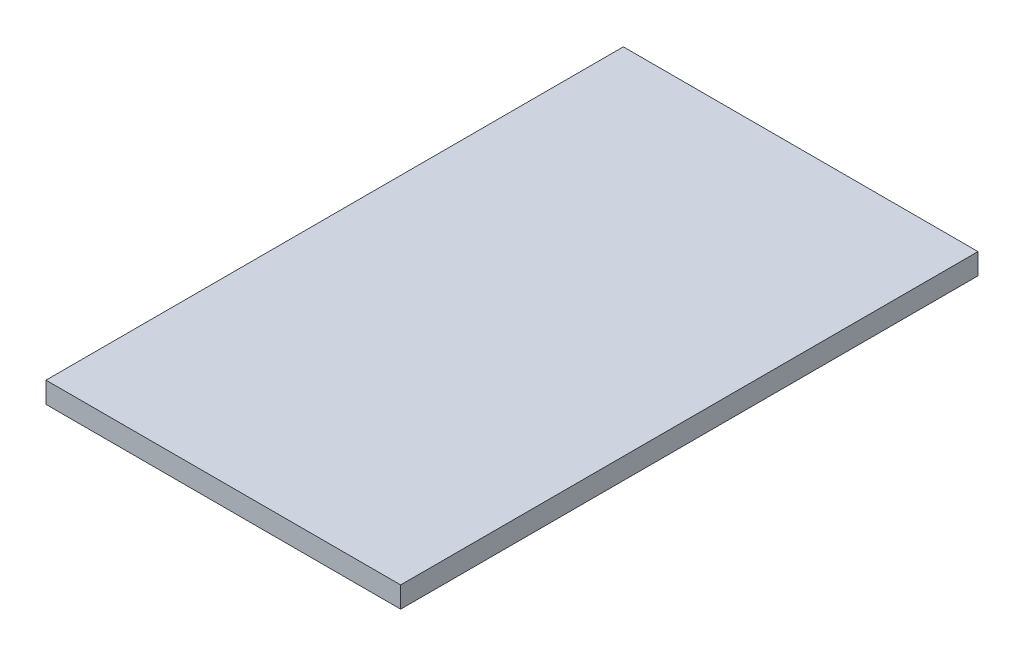
ISO-10303-21;
HEADER;
FILE_DESCRIPTION(('STEP AP214'),'2;1');
FILE_NAME('part.step','',(''),(''),'','','');
FILE_SCHEMA(('AUTOMOTIVE_DESIGN { 1 0 10303 214 1 1 1 1 }'));
ENDSEC;
DATA;
#1=APPLICATION_CONTEXT('core data for automotive mechanical design processes');
#2=APPLICATION_PROTOCOL_DEFINITION('international standard','automotive_design',2000,#1);
#3=PRODUCT_CONTEXT('',#1,'mechanical');
#4=PRODUCT('Part','Part','',(#3));
#5=PRODUCT_RELATED_PRODUCT_CATEGORY('part','',(#4));
#6=PRODUCT_DEFINITION_FORMATION('','',#4);
#7=PRODUCT_DEFINITION_CONTEXT('part definition',#1,'design');
#8=PRODUCT_DEFINITION('design','',#6,#7);
#9=PRODUCT_DEFINITION_SHAPE('','',#8);
#10=(LENGTH_UNIT() NAMED_UNIT(*) SI_UNIT(.MILLI.,.METRE.));
#11=(NAMED_UNIT(*) PLANE_ANGLE_UNIT() SI_UNIT($,.RADIAN.));
#12=(NAMED_UNIT(*) SI_UNIT($,.STERADIAN.) SOLID_ANGLE_UNIT());
#13=UNCERTAINTY_MEASURE_WITH_UNIT(LENGTH_MEASURE(1.E-05),#10,'distance_accuracy_value','');
#14=(GEOMETRIC_REPRESENTATION_CONTEXT(3) GLOBAL_UNCERTAINTY_ASSIGNED_CONTEXT((#13)) GLOBAL_UNIT_ASSIGNED_CONTEXT((#10,
#11,#12)) REPRESENTATION_CONTEXT('',''));
#15=CARTESIAN_POINT('',(0.,0.,0.));
#16=DIRECTION('',(0.,0.,1.));
#17=DIRECTION('',(1.,0.,0.));
#18=AXIS2_PLACEMENT_3D('',#15,#16,#17);
#19=CARTESIAN_POINT('',(21.5,2.55,35.));
#20=DIRECTION('',(-1.,0.,0.));
#21=DIRECTION('',(0.,0.,1.));
#22=AXIS2_PLACEMENT_3D('',#19,#20,#21);
#23=PLANE('',#22);
#24=DIRECTION('',(0.,0.,-1.));
#25=VECTOR('',#24,1.);
#26=CARTESIAN_POINT('',(21.5,0.,35.));
#27=LINE('',#26,#25);
#28=CARTESIAN_POINT('',(21.5,0.,35.));
#29=VERTEX_POINT('',#28);
#30=CARTESIAN_POINT('',(21.5,0.,-35.));
#31=VERTEX_POINT('',#30);
#32=EDGE_CURVE('E124',#29,#31,#27,.T.);
#33=ORIENTED_EDGE('',*,*,#32,.T.);
#34=DIRECTION('',(0.,-1.,0.));
#35=VECTOR('',#34,1.);
#36=CARTESIAN_POINT('',(21.5,2.55,-35.));
#37=LINE('',#36,#35);
#38=CARTESIAN_POINT('',(21.5,2.55,-35.));
#39=VERTEX_POINT('',#38);
#40=EDGE_CURVE('E11',#39,#31,#37,.T.);
#41=ORIENTED_EDGE('',*,*,#40,.F.);
#42=DIRECTION('',(0.,0.,-1.));
#43=VECTOR('',#42,1.);
#44=CARTESIAN_POINT('',(21.5,2.55,35.));
#45=LINE('',#44,#43);
#46=CARTESIAN_POINT('',(21.5,2.55,35.));
#47=VERTEX_POINT('',#46);
#48=EDGE_CURVE('E132',#47,#39,#45,.T.);
#49=ORIENTED_EDGE('',*,*,#48,.F.);
#50=DIRECTION('',(0.,-1.,0.));
#51=VECTOR('',#50,1.);
#52=CARTESIAN_POINT('',(21.5,2.55,35.));
#53=LINE('',#52,#51);
#54=EDGE_CURVE('E141',#47,#29,#53,.T.);
#55=ORIENTED_EDGE('',*,*,#54,.T.);
#56=EDGE_LOOP('',(#33,#41,#49,#55));
#57=FACE_BOUND('',#56,.T.);
#58=ADVANCED_FACE('F39',(#57),#23,.F.);
#59=CARTESIAN_POINT('',(-21.5,2.55,-35.));
#60=DIRECTION('',(0.,0.,1.));
#61=DIRECTION('',(1.,0.,0.));
#62=AXIS2_PLACEMENT_3D('',#59,#60,#61);
#63=PLANE('',#62);
#64=DIRECTION('',(-1.,0.,0.));
#65=VECTOR('',#64,1.);
#66=CARTESIAN_POINT('',(-21.5,0.,-35.));
#67=LINE('',#66,#65);
#68=CARTESIAN_POINT('',(10.16,0.,-35.));
#69=VERTEX_POINT('',#68);
#70=EDGE_CURVE('E143',#31,#69,#67,.T.);
#71=ORIENTED_EDGE('',*,*,#70,.T.);
#72=DIRECTION('',(0.,1.,0.));
#73=VECTOR('',#72,1.);
#74=CARTESIAN_POINT('',(10.16,-2.5,-35.));
#75=LINE('',#74,#73);
#76=CARTESIAN_POINT('',(10.16,-2.5,-35.));
#77=VERTEX_POINT('',#76);
#78=EDGE_CURVE('E108',#77,#69,#75,.T.);
#79=ORIENTED_EDGE('',*,*,#78,.F.);
#80=DIRECTION('',(1.,0.,0.));
#81=VECTOR('',#80,1.);
#82=CARTESIAN_POINT('',(-10.16,-2.5,-35.));
#83=LINE('',#82,#81);
#84=CARTESIAN_POINT('',(-10.16,-2.5,-35.));
#85=VERTEX_POINT('',#84);
#86=EDGE_CURVE('E101',#85,#77,#83,.T.);
#87=ORIENTED_EDGE('',*,*,#86,.F.);
#88=DIRECTION('',(0.,1.,0.));
#89=VECTOR('',#88,1.);
#90=CARTESIAN_POINT('',(-10.16,-2.5,-35.));
#91=LINE('',#90,#89);
#92=CARTESIAN_POINT('',(-10.16,0.,-35.));
#93=VERTEX_POINT('',#92);
#94=EDGE_CURVE('E106',#85,#93,#91,.T.);
#95=ORIENTED_EDGE('',*,*,#94,.T.);
#96=CARTESIAN_POINT('',(-21.5,0.,-35.));
#97=VERTEX_POINT('',#96);
#98=EDGE_CURVE('E58',#93,#97,#67,.T.);
#99=ORIENTED_EDGE('',*,*,#98,.T.);
#100=DIRECTION('',(0.,-1.,0.));
#101=VECTOR('',#100,1.);
#102=CARTESIAN_POINT('',(-21.5,2.55,-35.));
#103=LINE('',#102,#101);
#104=CARTESIAN_POINT('',(-21.5,2.55,-35.));
#105=VERTEX_POINT('',#104);
#106=EDGE_CURVE('E46',#105,#97,#103,.T.);
#107=ORIENTED_EDGE('',*,*,#106,.F.);
#108=DIRECTION('',(-1.,0.,0.));
#109=VECTOR('',#108,1.);
#110=CARTESIAN_POINT('',(-21.5,2.55,-35.));
#111=LINE('',#110,#109);
#112=EDGE_CURVE('E135',#39,#105,#111,.T.);
#113=ORIENTED_EDGE('',*,*,#112,.F.);
#114=ORIENTED_EDGE('',*,*,#40,.T.);
#115=EDGE_LOOP('',(#71,#79,#87,#95,#99,#107,#113,#114));
#116=FACE_BOUND('',#115,.T.);
#117=ADVANCED_FACE('F104',(#116),#63,.F.);
#118=CARTESIAN_POINT('',(-21.5,2.55,35.));
#119=DIRECTION('',(1.,0.,0.));
#120=DIRECTION('',(0.,0.,-1.));
#121=AXIS2_PLACEMENT_3D('',#118,#119,#120);
#122=PLANE('',#121);
#123=DIRECTION('',(0.,0.,1.));
#124=VECTOR('',#123,1.);
#125=CARTESIAN_POINT('',(-21.5,0.,35.));
#126=LINE('',#125,#124);
#127=CARTESIAN_POINT('',(-21.5,0.,35.));
#128=VERTEX_POINT('',#127);
#129=EDGE_CURVE('E145',#97,#128,#126,.T.);
#130=ORIENTED_EDGE('',*,*,#129,.T.);
#131=DIRECTION('',(0.,-1.,0.));
#132=VECTOR('',#131,1.);
#133=CARTESIAN_POINT('',(-21.5,2.55,35.));
#134=LINE('',#133,#132);
#135=CARTESIAN_POINT('',(-21.5,2.55,35.));
#136=VERTEX_POINT('',#135);
#137=EDGE_CURVE('E150',#136,#128,#134,.T.);
#138=ORIENTED_EDGE('',*,*,#137,.F.);
#139=DIRECTION('',(0.,0.,1.));
#140=VECTOR('',#139,1.);
#141=CARTESIAN_POINT('',(-21.5,2.55,35.));
#142=LINE('',#141,#140);
#143=EDGE_CURVE('E138',#105,#136,#142,.T.);
#144=ORIENTED_EDGE('',*,*,#143,.F.);
#145=ORIENTED_EDGE('',*,*,#106,.T.);
#146=EDGE_LOOP('',(#130,#138,#144,#145));
#147=FACE_BOUND('',#146,.T.);
#148=ADVANCED_FACE('F156',(#147),#122,.F.);
#149=CARTESIAN_POINT('',(-21.5,2.55,35.));
#150=DIRECTION('',(0.,0.,-1.));
#151=DIRECTION('',(-1.,0.,0.));
#152=AXIS2_PLACEMENT_3D('',#149,#150,#151);
#153=PLANE('',#152);
#154=DIRECTION('',(1.,0.,0.));
#155=VECTOR('',#154,1.);
#156=CARTESIAN_POINT('',(-21.5,0.,35.));
#157=LINE('',#156,#155);
#158=EDGE_CURVE('E136',#128,#29,#157,.T.);
#159=ORIENTED_EDGE('',*,*,#158,.T.);
#160=ORIENTED_EDGE('',*,*,#54,.F.);
#161=DIRECTION('',(1.,0.,0.));
#162=VECTOR('',#161,1.);
#163=CARTESIAN_POINT('',(-21.5,2.55,35.));
#164=LINE('',#163,#162);
#165=EDGE_CURVE('E140',#136,#47,#164,.T.);
#166=ORIENTED_EDGE('',*,*,#165,.F.);
#167=ORIENTED_EDGE('',*,*,#137,.T.);
#168=EDGE_LOOP('',(#159,#160,#166,#167));
#169=FACE_BOUND('',#168,.T.);
#170=ADVANCED_FACE('F163',(#169),#153,.F.);
#171=CARTESIAN_POINT('',(0.,2.55,0.));
#172=DIRECTION('',(0.,-1.,0.));
#173=DIRECTION('',(0.,0.,-1.));
#174=AXIS2_PLACEMENT_3D('',#171,#172,#173);
#175=PLANE('',#174);
#176=ORIENTED_EDGE('',*,*,#48,.T.);
#177=ORIENTED_EDGE('',*,*,#112,.T.);
#178=ORIENTED_EDGE('',*,*,#143,.T.);
#179=ORIENTED_EDGE('',*,*,#165,.T.);
#180=EDGE_LOOP('',(#176,#177,#178,#179));
#181=FACE_BOUND('',#180,.T.);
#182=ADVANCED_FACE('F169',(#181),#175,.F.);
#183=CARTESIAN_POINT('',(0.,0.,0.));
#184=DIRECTION('',(0.,-1.,0.));
#185=DIRECTION('',(0.,0.,-1.));
#186=AXIS2_PLACEMENT_3D('',#183,#184,#185);
#187=PLANE('',#186);
#188=DIRECTION('',(0.,0.,-1.));
#189=VECTOR('',#188,1.);
#190=CARTESIAN_POINT('',(-10.16,0.,-32.46));
#191=LINE('',#190,#189);
#192=CARTESIAN_POINT('',(-10.16,0.,-32.46));
#193=VERTEX_POINT('',#192);
#194=EDGE_CURVE('E53',#193,#93,#191,.T.);
#195=ORIENTED_EDGE('',*,*,#194,.F.);
#196=DIRECTION('',(-1.,0.,0.));
#197=VECTOR('',#196,1.);
#198=CARTESIAN_POINT('',(-10.16,0.,-32.46));
#199=LINE('',#198,#197);
#200=CARTESIAN_POINT('',(10.16,0.,-32.46));
#201=VERTEX_POINT('',#200);
#202=EDGE_CURVE('E121',#201,#193,#199,.T.);
#203=ORIENTED_EDGE('',*,*,#202,.F.);
#204=DIRECTION('',(0.,0.,1.));
#205=VECTOR('',#204,1.);
#206=CARTESIAN_POINT('',(10.16,0.,-32.46));
#207=LINE('',#206,#205);
#208=EDGE_CURVE('E174',#69,#201,#207,.T.);
#209=ORIENTED_EDGE('',*,*,#208,.F.);
#210=ORIENTED_EDGE('',*,*,#70,.F.);
#211=ORIENTED_EDGE('',*,*,#32,.F.);
#212=ORIENTED_EDGE('',*,*,#158,.F.);
#213=ORIENTED_EDGE('',*,*,#129,.F.);
#214=ORIENTED_EDGE('',*,*,#98,.F.);
#215=EDGE_LOOP('',(#195,#203,#209,#210,#211,#212,#213,#214));
#216=FACE_BOUND('',#215,.T.);
#217=ADVANCED_FACE('F159',(#216),#187,.T.);
#218=CARTESIAN_POINT('',(-10.16,-2.5,-32.46));
#219=DIRECTION('',(1.,0.,0.));
#220=DIRECTION('',(0.,0.,-1.));
#221=AXIS2_PLACEMENT_3D('',#218,#219,#220);
#222=PLANE('',#221);
#223=ORIENTED_EDGE('',*,*,#194,.T.);
#224=ORIENTED_EDGE('',*,*,#94,.F.);
#225=DIRECTION('',(0.,0.,-1.));
#226=VECTOR('',#225,1.);
#227=CARTESIAN_POINT('',(-10.16,-2.5,-32.46));
#228=LINE('',#227,#226);
#229=CARTESIAN_POINT('',(-10.16,-2.5,-32.46));
#230=VERTEX_POINT('',#229);
#231=EDGE_CURVE('E112',#230,#85,#228,.T.);
#232=ORIENTED_EDGE('',*,*,#231,.F.);
#233=DIRECTION('',(0.,1.,0.));
#234=VECTOR('',#233,1.);
#235=CARTESIAN_POINT('',(-10.16,-2.5,-32.46));
#236=LINE('',#235,#234);
#237=EDGE_CURVE('E177',#230,#193,#236,.T.);
#238=ORIENTED_EDGE('',*,*,#237,.T.);
#239=EDGE_LOOP('',(#223,#224,#232,#238));
#240=FACE_BOUND('',#239,.T.);
#241=ADVANCED_FACE('F123',(#240),#222,.F.);
#242=CARTESIAN_POINT('',(10.16,-2.5,-32.46));
#243=DIRECTION('',(-1.,0.,0.));
#244=DIRECTION('',(0.,0.,1.));
#245=AXIS2_PLACEMENT_3D('',#242,#243,#244);
#246=PLANE('',#245);
#247=ORIENTED_EDGE('',*,*,#208,.T.);
#248=DIRECTION('',(0.,1.,0.));
#249=VECTOR('',#248,1.);
#250=CARTESIAN_POINT('',(10.16,-2.5,-32.46));
#251=LINE('',#250,#249);
#252=CARTESIAN_POINT('',(10.16,-2.5,-32.46));
#253=VERTEX_POINT('',#252);
#254=EDGE_CURVE('E128',#253,#201,#251,.T.);
#255=ORIENTED_EDGE('',*,*,#254,.F.);
#256=DIRECTION('',(0.,0.,1.));
#257=VECTOR('',#256,1.);
#258=CARTESIAN_POINT('',(10.16,-2.5,-32.46));
#259=LINE('',#258,#257);
#260=EDGE_CURVE('E111',#77,#253,#259,.T.);
#261=ORIENTED_EDGE('',*,*,#260,.F.);
#262=ORIENTED_EDGE('',*,*,#78,.T.);
#263=EDGE_LOOP('',(#247,#255,#261,#262));
#264=FACE_BOUND('',#263,.T.);
#265=ADVANCED_FACE('F172',(#264),#246,.F.);
#266=CARTESIAN_POINT('',(-10.16,-2.5,-32.46));
#267=DIRECTION('',(0.,0.,-1.));
#268=DIRECTION('',(-1.,0.,0.));
#269=AXIS2_PLACEMENT_3D('',#266,#267,#268);
#270=PLANE('',#269);
#271=ORIENTED_EDGE('',*,*,#202,.T.);
#272=ORIENTED_EDGE('',*,*,#237,.F.);
#273=DIRECTION('',(-1.,0.,0.));
#274=VECTOR('',#273,1.);
#275=CARTESIAN_POINT('',(-10.16,-2.5,-32.46));
#276=LINE('',#275,#274);
#277=EDGE_CURVE('E117',#253,#230,#276,.T.);
#278=ORIENTED_EDGE('',*,*,#277,.F.);
#279=ORIENTED_EDGE('',*,*,#254,.T.);
#280=EDGE_LOOP('',(#271,#272,#278,#279));
#281=FACE_BOUND('',#280,.T.);
#282=ADVANCED_FACE('F184',(#281),#270,.F.);
#283=CARTESIAN_POINT('',(0.,-2.5,0.));
#284=DIRECTION('',(0.,-1.,0.));
#285=DIRECTION('',(0.,0.,-1.));
#286=AXIS2_PLACEMENT_3D('',#283,#284,#285);
#287=PLANE('',#286);
#288=ORIENTED_EDGE('',*,*,#231,.T.);
#289=ORIENTED_EDGE('',*,*,#86,.T.);
#290=ORIENTED_EDGE('',*,*,#260,.T.);
#291=ORIENTED_EDGE('',*,*,#277,.T.);
#292=EDGE_LOOP('',(#288,#289,#290,#291));
#293=FACE_BOUND('',#292,.T.);
#294=ADVANCED_FACE('F115',(#293),#287,.T.);
#295=CLOSED_SHELL('',(#58,#117,#148,#170,#182,#217,#241,#265,#282,#294));
#296=MANIFOLD_SOLID_BREP('B2',#295);
#297=ADVANCED_BREP_SHAPE_REPRESENTATION('',(#18,#296),#14);
#298=SHAPE_DEFINITION_REPRESENTATION(#9,#297);
ENDSEC;
END-ISO-10303-21;
